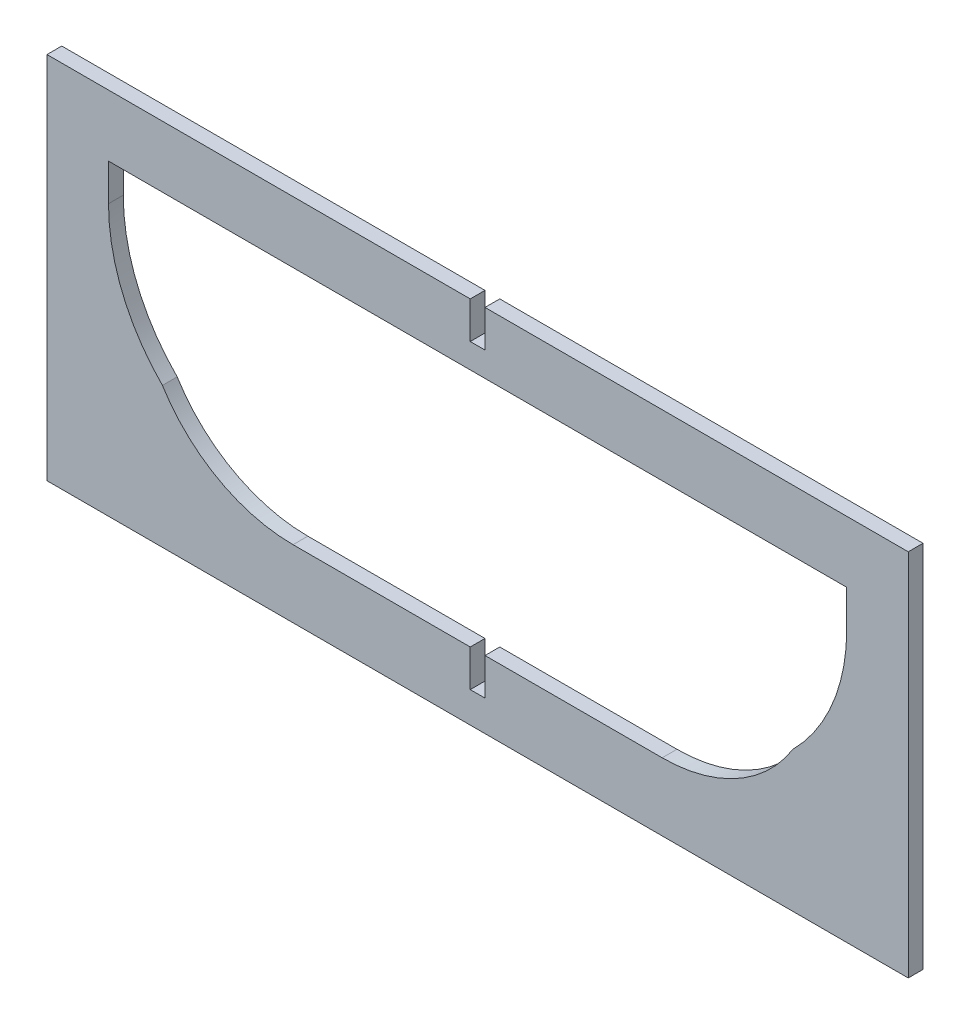
ISO-10303-21;
HEADER;
FILE_DESCRIPTION(('STEP AP214'),'2;1');
FILE_NAME('part.step','',(''),(''),'','','');
FILE_SCHEMA(('AUTOMOTIVE_DESIGN { 1 0 10303 214 1 1 1 1 }'));
ENDSEC;
DATA;
#1=APPLICATION_CONTEXT('core data for automotive mechanical design processes');
#2=APPLICATION_PROTOCOL_DEFINITION('international standard','automotive_design',2000,#1);
#3=PRODUCT_CONTEXT('',#1,'mechanical');
#4=PRODUCT('Part','Part','',(#3));
#5=PRODUCT_RELATED_PRODUCT_CATEGORY('part','',(#4));
#6=PRODUCT_DEFINITION_FORMATION('','',#4);
#7=PRODUCT_DEFINITION_CONTEXT('part definition',#1,'design');
#8=PRODUCT_DEFINITION('design','',#6,#7);
#9=PRODUCT_DEFINITION_SHAPE('','',#8);
#10=(LENGTH_UNIT() NAMED_UNIT(*) SI_UNIT(.MILLI.,.METRE.));
#11=(NAMED_UNIT(*) PLANE_ANGLE_UNIT() SI_UNIT($,.RADIAN.));
#12=(NAMED_UNIT(*) SI_UNIT($,.STERADIAN.) SOLID_ANGLE_UNIT());
#13=UNCERTAINTY_MEASURE_WITH_UNIT(LENGTH_MEASURE(1.E-05),#10,'distance_accuracy_value','');
#14=(GEOMETRIC_REPRESENTATION_CONTEXT(3) GLOBAL_UNCERTAINTY_ASSIGNED_CONTEXT((#13)) GLOBAL_UNIT_ASSIGNED_CONTEXT((#10,
#11,#12)) REPRESENTATION_CONTEXT('',''));
#15=CARTESIAN_POINT('',(0.,0.,0.));
#16=DIRECTION('',(0.,0.,1.));
#17=DIRECTION('',(1.,0.,0.));
#18=AXIS2_PLACEMENT_3D('',#15,#16,#17);
#19=CARTESIAN_POINT('',(-200.,150.,6.));
#20=DIRECTION('',(0.,-1.,0.));
#21=DIRECTION('',(1.,0.,0.));
#22=AXIS2_PLACEMENT_3D('',#19,#20,#21);
#23=PLANE('',#22);
#24=DIRECTION('',(-1.,0.,0.));
#25=VECTOR('',#24,1.);
#26=CARTESIAN_POINT('',(-200.,150.,6.));
#27=LINE('',#26,#25);
#28=CARTESIAN_POINT('',(-178.,150.,6.));
#29=VERTEX_POINT('',#28);
#30=CARTESIAN_POINT('',(-350.,150.,6.));
#31=VERTEX_POINT('',#30);
#32=EDGE_CURVE('E372',#29,#31,#27,.T.);
#33=ORIENTED_EDGE('',*,*,#32,.F.);
#34=DIRECTION('',(0.,0.,1.));
#35=VECTOR('',#34,1.);
#36=CARTESIAN_POINT('',(-178.,150.,0.));
#37=LINE('',#36,#35);
#38=CARTESIAN_POINT('',(-178.,150.,0.));
#39=VERTEX_POINT('',#38);
#40=EDGE_CURVE('E221',#39,#29,#37,.T.);
#41=ORIENTED_EDGE('',*,*,#40,.F.);
#42=DIRECTION('',(-1.,0.,0.));
#43=VECTOR('',#42,1.);
#44=CARTESIAN_POINT('',(-200.,150.,0.));
#45=LINE('',#44,#43);
#46=CARTESIAN_POINT('',(-350.,150.,0.));
#47=VERTEX_POINT('',#46);
#48=EDGE_CURVE('E207',#39,#47,#45,.T.);
#49=ORIENTED_EDGE('',*,*,#48,.T.);
#50=DIRECTION('',(0.,0.,1.));
#51=VECTOR('',#50,1.);
#52=CARTESIAN_POINT('',(-350.,150.,0.));
#53=LINE('',#52,#51);
#54=EDGE_CURVE('E304',#47,#31,#53,.T.);
#55=ORIENTED_EDGE('',*,*,#54,.T.);
#56=EDGE_LOOP('',(#33,#41,#49,#55));
#57=FACE_BOUND('',#56,.T.);
#58=ADVANCED_FACE('F43',(#57),#23,.F.);
#59=CARTESIAN_POINT('',(-100.,27.5,0.));
#60=DIRECTION('',(0.,-1.,0.));
#61=DIRECTION('',(0.,0.,-1.));
#62=AXIS2_PLACEMENT_3D('',#59,#60,#61);
#63=PLANE('',#62);
#64=DIRECTION('',(1.,0.,0.));
#65=VECTOR('',#64,1.);
#66=CARTESIAN_POINT('',(-100.,27.5,6.));
#67=LINE('',#66,#65);
#68=CARTESIAN_POINT('',(-250.,27.5,6.));
#69=VERTEX_POINT('',#68);
#70=CARTESIAN_POINT('',(-178.,27.5,6.));
#71=VERTEX_POINT('',#70);
#72=EDGE_CURVE('E323',#69,#71,#67,.T.);
#73=ORIENTED_EDGE('',*,*,#72,.T.);
#74=DIRECTION('',(0.,0.,1.));
#75=VECTOR('',#74,1.);
#76=CARTESIAN_POINT('',(-178.,27.5,0.));
#77=LINE('',#76,#75);
#78=CARTESIAN_POINT('',(-178.,27.5,0.));
#79=VERTEX_POINT('',#78);
#80=EDGE_CURVE('E240',#79,#71,#77,.T.);
#81=ORIENTED_EDGE('',*,*,#80,.F.);
#82=DIRECTION('',(1.,0.,0.));
#83=VECTOR('',#82,1.);
#84=CARTESIAN_POINT('',(-100.,27.5,0.));
#85=LINE('',#84,#83);
#86=CARTESIAN_POINT('',(-250.,27.5,0.));
#87=VERTEX_POINT('',#86);
#88=EDGE_CURVE('E317',#87,#79,#85,.T.);
#89=ORIENTED_EDGE('',*,*,#88,.F.);
#90=DIRECTION('',(0.,0.,1.));
#91=VECTOR('',#90,1.);
#92=CARTESIAN_POINT('',(-250.,27.5,0.));
#93=LINE('',#92,#91);
#94=EDGE_CURVE('E295',#87,#69,#93,.T.);
#95=ORIENTED_EDGE('',*,*,#94,.T.);
#96=EDGE_LOOP('',(#73,#81,#89,#95));
#97=FACE_BOUND('',#96,.T.);
#98=ADVANCED_FACE('F446',(#97),#63,.F.);
#99=CARTESIAN_POINT('',(0.,0.,6.));
#100=DIRECTION('',(0.,0.,-1.));
#101=DIRECTION('',(-1.,0.,0.));
#102=AXIS2_PLACEMENT_3D('',#99,#100,#101);
#103=PLANE('',#102);
#104=DIRECTION('',(1.,0.,0.));
#105=VECTOR('',#104,1.);
#106=CARTESIAN_POINT('',(-178.,135.,6.));
#107=LINE('',#106,#105);
#108=CARTESIAN_POINT('',(-178.,135.,6.));
#109=VERTEX_POINT('',#108);
#110=CARTESIAN_POINT('',(-172.,135.,6.));
#111=VERTEX_POINT('',#110);
#112=EDGE_CURVE('E211',#109,#111,#107,.T.);
#113=ORIENTED_EDGE('',*,*,#112,.F.);
#114=DIRECTION('',(0.,-1.,0.));
#115=VECTOR('',#114,1.);
#116=CARTESIAN_POINT('',(-178.,150.,6.));
#117=LINE('',#116,#115);
#118=EDGE_CURVE('E187',#29,#109,#117,.T.);
#119=ORIENTED_EDGE('',*,*,#118,.F.);
#120=ORIENTED_EDGE('',*,*,#32,.T.);
#121=DIRECTION('',(0.,-1.,0.));
#122=VECTOR('',#121,1.);
#123=CARTESIAN_POINT('',(-350.,0.,6.));
#124=LINE('',#123,#122);
#125=CARTESIAN_POINT('',(-350.,0.,6.));
#126=VERTEX_POINT('',#125);
#127=EDGE_CURVE('E268',#31,#126,#124,.T.);
#128=ORIENTED_EDGE('',*,*,#127,.T.);
#129=DIRECTION('',(1.,0.,0.));
#130=VECTOR('',#129,1.);
#131=CARTESIAN_POINT('',(0.,0.,6.));
#132=LINE('',#131,#130);
#133=CARTESIAN_POINT('',(0.,0.,6.));
#134=VERTEX_POINT('',#133);
#135=EDGE_CURVE('E378',#126,#134,#132,.T.);
#136=ORIENTED_EDGE('',*,*,#135,.T.);
#137=DIRECTION('',(0.,1.,0.));
#138=VECTOR('',#137,1.);
#139=CARTESIAN_POINT('',(0.,0.,6.));
#140=LINE('',#139,#138);
#141=CARTESIAN_POINT('',(0.,150.,6.));
#142=VERTEX_POINT('',#141);
#143=EDGE_CURVE('E368',#134,#142,#140,.T.);
#144=ORIENTED_EDGE('',*,*,#143,.T.);
#145=CARTESIAN_POINT('',(-172.,150.,6.));
#146=VERTEX_POINT('',#145);
#147=EDGE_CURVE('E374',#142,#146,#27,.T.);
#148=ORIENTED_EDGE('',*,*,#147,.T.);
#149=DIRECTION('',(0.,1.,0.));
#150=VECTOR('',#149,1.);
#151=CARTESIAN_POINT('',(-172.,150.,6.));
#152=LINE('',#151,#150);
#153=EDGE_CURVE('E59',#111,#146,#152,.T.);
#154=ORIENTED_EDGE('',*,*,#153,.F.);
#155=EDGE_LOOP('',(#113,#119,#120,#128,#136,#144,#148,#154));
#156=FACE_BOUND('',#155,.T.);
#157=DIRECTION('',(1.,0.,0.));
#158=VECTOR('',#157,1.);
#159=CARTESIAN_POINT('',(-178.,12.5,6.));
#160=LINE('',#159,#158);
#161=CARTESIAN_POINT('',(-178.,12.5,6.));
#162=VERTEX_POINT('',#161);
#163=CARTESIAN_POINT('',(-172.,12.5,6.));
#164=VERTEX_POINT('',#163);
#165=EDGE_CURVE('E245',#162,#164,#160,.T.);
#166=ORIENTED_EDGE('',*,*,#165,.F.);
#167=DIRECTION('',(0.,-1.,0.));
#168=VECTOR('',#167,1.);
#169=CARTESIAN_POINT('',(-178.,27.5,6.));
#170=LINE('',#169,#168);
#171=EDGE_CURVE('E218',#71,#162,#170,.T.);
#172=ORIENTED_EDGE('',*,*,#171,.F.);
#173=ORIENTED_EDGE('',*,*,#72,.F.);
#174=CARTESIAN_POINT('',(-250.,90.,6.));
#175=DIRECTION('',(0.,0.,-1.));
#176=DIRECTION('',(1.,0.,0.));
#177=AXIS2_PLACEMENT_3D('',#174,#175,#176);
#178=CIRCLE('',#177,62.5);
#179=CARTESIAN_POINT('',(-303.097189411847,57.03125,6.));
#180=VERTEX_POINT('',#179);
#181=EDGE_CURVE('E224',#69,#180,#178,.T.);
#182=ORIENTED_EDGE('',*,*,#181,.T.);
#183=CARTESIAN_POINT('',(-250.,110.,6.));
#184=DIRECTION('',(0.,0.,-1.));
#185=DIRECTION('',(1.,0.,0.));
#186=AXIS2_PLACEMENT_3D('',#183,#184,#185);
#187=CIRCLE('',#186,75.);
#188=CARTESIAN_POINT('',(-325.,110.,6.));
#189=VERTEX_POINT('',#188);
#190=EDGE_CURVE('E284',#180,#189,#187,.T.);
#191=ORIENTED_EDGE('',*,*,#190,.T.);
#192=DIRECTION('',(0.,1.,0.));
#193=VECTOR('',#192,1.);
#194=CARTESIAN_POINT('',(-325.,110.,6.));
#195=LINE('',#194,#193);
#196=CARTESIAN_POINT('',(-325.,125.,6.));
#197=VERTEX_POINT('',#196);
#198=EDGE_CURVE('E288',#189,#197,#195,.T.);
#199=ORIENTED_EDGE('',*,*,#198,.T.);
#200=DIRECTION('',(-1.,0.,0.));
#201=VECTOR('',#200,1.);
#202=CARTESIAN_POINT('',(-175.,125.,6.));
#203=LINE('',#202,#201);
#204=CARTESIAN_POINT('',(-25.,125.,6.));
#205=VERTEX_POINT('',#204);
#206=EDGE_CURVE('E338',#205,#197,#203,.T.);
#207=ORIENTED_EDGE('',*,*,#206,.F.);
#208=DIRECTION('',(0.,1.,0.));
#209=VECTOR('',#208,1.);
#210=CARTESIAN_POINT('',(-25.,110.,6.));
#211=LINE('',#210,#209);
#212=CARTESIAN_POINT('',(-25.,110.,6.));
#213=VERTEX_POINT('',#212);
#214=EDGE_CURVE('E334',#213,#205,#211,.T.);
#215=ORIENTED_EDGE('',*,*,#214,.F.);
#216=CARTESIAN_POINT('',(-100.,110.,6.));
#217=DIRECTION('',(0.,0.,1.));
#218=DIRECTION('',(1.,0.,0.));
#219=AXIS2_PLACEMENT_3D('',#216,#217,#218);
#220=CIRCLE('',#219,75.);
#221=CARTESIAN_POINT('',(-46.9028105881536,57.03125,6.));
#222=VERTEX_POINT('',#221);
#223=EDGE_CURVE('E331',#222,#213,#220,.T.);
#224=ORIENTED_EDGE('',*,*,#223,.F.);
#225=CARTESIAN_POINT('',(-100.,90.,6.));
#226=DIRECTION('',(0.,0.,1.));
#227=DIRECTION('',(1.,0.,0.));
#228=AXIS2_PLACEMENT_3D('',#225,#226,#227);
#229=CIRCLE('',#228,62.5);
#230=CARTESIAN_POINT('',(-100.,27.5,6.));
#231=VERTEX_POINT('',#230);
#232=EDGE_CURVE('E341',#231,#222,#229,.T.);
#233=ORIENTED_EDGE('',*,*,#232,.F.);
#234=CARTESIAN_POINT('',(-172.,27.5,6.));
#235=VERTEX_POINT('',#234);
#236=EDGE_CURVE('E299',#235,#231,#67,.T.);
#237=ORIENTED_EDGE('',*,*,#236,.F.);
#238=DIRECTION('',(0.,1.,0.));
#239=VECTOR('',#238,1.);
#240=CARTESIAN_POINT('',(-172.,27.5,6.));
#241=LINE('',#240,#239);
#242=EDGE_CURVE('E67',#164,#235,#241,.T.);
#243=ORIENTED_EDGE('',*,*,#242,.F.);
#244=EDGE_LOOP('',(#166,#172,#173,#182,#191,#199,#207,#215,#224,#233,#237,#243));
#245=FACE_BOUND('',#244,.T.);
#246=ADVANCED_FACE('F401',(#156,#245),#103,.F.);
#247=CARTESIAN_POINT('',(0.,0.,0.));
#248=DIRECTION('',(0.,0.,-1.));
#249=DIRECTION('',(-1.,0.,0.));
#250=AXIS2_PLACEMENT_3D('',#247,#248,#249);
#251=PLANE('',#250);
#252=DIRECTION('',(0.,-1.,0.));
#253=VECTOR('',#252,1.);
#254=CARTESIAN_POINT('',(-178.,150.,0.));
#255=LINE('',#254,#253);
#256=CARTESIAN_POINT('',(-178.,135.,0.));
#257=VERTEX_POINT('',#256);
#258=EDGE_CURVE('E184',#39,#257,#255,.T.);
#259=ORIENTED_EDGE('',*,*,#258,.T.);
#260=DIRECTION('',(1.,0.,0.));
#261=VECTOR('',#260,1.);
#262=CARTESIAN_POINT('',(-178.,135.,0.));
#263=LINE('',#262,#261);
#264=CARTESIAN_POINT('',(-172.,135.,0.));
#265=VERTEX_POINT('',#264);
#266=EDGE_CURVE('E196',#257,#265,#263,.T.);
#267=ORIENTED_EDGE('',*,*,#266,.T.);
#268=DIRECTION('',(0.,1.,0.));
#269=VECTOR('',#268,1.);
#270=CARTESIAN_POINT('',(-172.,150.,0.));
#271=LINE('',#270,#269);
#272=CARTESIAN_POINT('',(-172.,150.,0.));
#273=VERTEX_POINT('',#272);
#274=EDGE_CURVE('E193',#265,#273,#271,.T.);
#275=ORIENTED_EDGE('',*,*,#274,.T.);
#276=CARTESIAN_POINT('',(0.,150.,0.));
#277=VERTEX_POINT('',#276);
#278=EDGE_CURVE('E384',#277,#273,#45,.T.);
#279=ORIENTED_EDGE('',*,*,#278,.F.);
#280=DIRECTION('',(0.,1.,0.));
#281=VECTOR('',#280,1.);
#282=CARTESIAN_POINT('',(0.,0.,0.));
#283=LINE('',#282,#281);
#284=CARTESIAN_POINT('',(0.,0.,0.));
#285=VERTEX_POINT('',#284);
#286=EDGE_CURVE('E367',#285,#277,#283,.T.);
#287=ORIENTED_EDGE('',*,*,#286,.F.);
#288=DIRECTION('',(1.,0.,0.));
#289=VECTOR('',#288,1.);
#290=CARTESIAN_POINT('',(0.,0.,0.));
#291=LINE('',#290,#289);
#292=CARTESIAN_POINT('',(-350.,0.,0.));
#293=VERTEX_POINT('',#292);
#294=EDGE_CURVE('E373',#293,#285,#291,.T.);
#295=ORIENTED_EDGE('',*,*,#294,.F.);
#296=DIRECTION('',(0.,-1.,0.));
#297=VECTOR('',#296,1.);
#298=CARTESIAN_POINT('',(-350.,0.,0.));
#299=LINE('',#298,#297);
#300=EDGE_CURVE('E276',#47,#293,#299,.T.);
#301=ORIENTED_EDGE('',*,*,#300,.F.);
#302=ORIENTED_EDGE('',*,*,#48,.F.);
#303=EDGE_LOOP('',(#259,#267,#275,#279,#287,#295,#301,#302));
#304=FACE_BOUND('',#303,.T.);
#305=DIRECTION('',(0.,-1.,0.));
#306=VECTOR('',#305,1.);
#307=CARTESIAN_POINT('',(-178.,27.5,0.));
#308=LINE('',#307,#306);
#309=CARTESIAN_POINT('',(-178.,12.5,0.));
#310=VERTEX_POINT('',#309);
#311=EDGE_CURVE('E246',#79,#310,#308,.T.);
#312=ORIENTED_EDGE('',*,*,#311,.T.);
#313=DIRECTION('',(1.,0.,0.));
#314=VECTOR('',#313,1.);
#315=CARTESIAN_POINT('',(-178.,12.5,0.));
#316=LINE('',#315,#314);
#317=CARTESIAN_POINT('',(-172.,12.5,0.));
#318=VERTEX_POINT('',#317);
#319=EDGE_CURVE('E256',#310,#318,#316,.T.);
#320=ORIENTED_EDGE('',*,*,#319,.T.);
#321=DIRECTION('',(0.,1.,0.));
#322=VECTOR('',#321,1.);
#323=CARTESIAN_POINT('',(-172.,27.5,0.));
#324=LINE('',#323,#322);
#325=CARTESIAN_POINT('',(-172.,27.5,0.));
#326=VERTEX_POINT('',#325);
#327=EDGE_CURVE('E233',#318,#326,#324,.T.);
#328=ORIENTED_EDGE('',*,*,#327,.T.);
#329=CARTESIAN_POINT('',(-100.,27.5,0.));
#330=VERTEX_POINT('',#329);
#331=EDGE_CURVE('E322',#326,#330,#85,.T.);
#332=ORIENTED_EDGE('',*,*,#331,.T.);
#333=CARTESIAN_POINT('',(-100.,90.,0.));
#334=DIRECTION('',(0.,0.,1.));
#335=DIRECTION('',(1.,0.,0.));
#336=AXIS2_PLACEMENT_3D('',#333,#334,#335);
#337=CIRCLE('',#336,62.5);
#338=CARTESIAN_POINT('',(-46.9028105881536,57.03125,0.));
#339=VERTEX_POINT('',#338);
#340=EDGE_CURVE('E335',#330,#339,#337,.T.);
#341=ORIENTED_EDGE('',*,*,#340,.T.);
#342=CARTESIAN_POINT('',(-100.,110.,0.));
#343=DIRECTION('',(0.,0.,1.));
#344=DIRECTION('',(1.,0.,0.));
#345=AXIS2_PLACEMENT_3D('',#342,#343,#344);
#346=CIRCLE('',#345,75.);
#347=CARTESIAN_POINT('',(-25.,110.,0.));
#348=VERTEX_POINT('',#347);
#349=EDGE_CURVE('E330',#339,#348,#346,.T.);
#350=ORIENTED_EDGE('',*,*,#349,.T.);
#351=DIRECTION('',(0.,1.,0.));
#352=VECTOR('',#351,1.);
#353=CARTESIAN_POINT('',(-25.,110.,0.));
#354=LINE('',#353,#352);
#355=CARTESIAN_POINT('',(-25.,125.,0.));
#356=VERTEX_POINT('',#355);
#357=EDGE_CURVE('E348',#348,#356,#354,.T.);
#358=ORIENTED_EDGE('',*,*,#357,.T.);
#359=DIRECTION('',(-1.,0.,0.));
#360=VECTOR('',#359,1.);
#361=CARTESIAN_POINT('',(-175.,125.,0.));
#362=LINE('',#361,#360);
#363=CARTESIAN_POINT('',(-325.,125.,0.));
#364=VERTEX_POINT('',#363);
#365=EDGE_CURVE('E352',#356,#364,#362,.T.);
#366=ORIENTED_EDGE('',*,*,#365,.T.);
#367=DIRECTION('',(0.,1.,0.));
#368=VECTOR('',#367,1.);
#369=CARTESIAN_POINT('',(-325.,110.,0.));
#370=LINE('',#369,#368);
#371=CARTESIAN_POINT('',(-325.,110.,0.));
#372=VERTEX_POINT('',#371);
#373=EDGE_CURVE('E272',#372,#364,#370,.T.);
#374=ORIENTED_EDGE('',*,*,#373,.F.);
#375=CARTESIAN_POINT('',(-250.,110.,0.));
#376=DIRECTION('',(0.,0.,-1.));
#377=DIRECTION('',(1.,0.,0.));
#378=AXIS2_PLACEMENT_3D('',#375,#376,#377);
#379=CIRCLE('',#378,75.);
#380=CARTESIAN_POINT('',(-303.097189411847,57.03125,0.));
#381=VERTEX_POINT('',#380);
#382=EDGE_CURVE('E267',#381,#372,#379,.T.);
#383=ORIENTED_EDGE('',*,*,#382,.F.);
#384=CARTESIAN_POINT('',(-250.,90.,0.));
#385=DIRECTION('',(0.,0.,-1.));
#386=DIRECTION('',(1.,0.,0.));
#387=AXIS2_PLACEMENT_3D('',#384,#385,#386);
#388=CIRCLE('',#387,62.5);
#389=EDGE_CURVE('E263',#87,#381,#388,.T.);
#390=ORIENTED_EDGE('',*,*,#389,.F.);
#391=ORIENTED_EDGE('',*,*,#88,.T.);
#392=EDGE_LOOP('',(#312,#320,#328,#332,#341,#350,#358,#366,#374,#383,#390,#391));
#393=FACE_BOUND('',#392,.T.);
#394=ADVANCED_FACE('F204',(#304,#393),#251,.T.);
#395=CARTESIAN_POINT('',(0.,0.,6.));
#396=DIRECTION('',(-1.,0.,0.));
#397=DIRECTION('',(0.,-1.,0.));
#398=AXIS2_PLACEMENT_3D('',#395,#396,#397);
#399=PLANE('',#398);
#400=ORIENTED_EDGE('',*,*,#286,.T.);
#401=DIRECTION('',(0.,0.,-1.));
#402=VECTOR('',#401,1.);
#403=CARTESIAN_POINT('',(0.,150.,6.));
#404=LINE('',#403,#402);
#405=EDGE_CURVE('E11',#142,#277,#404,.T.);
#406=ORIENTED_EDGE('',*,*,#405,.F.);
#407=ORIENTED_EDGE('',*,*,#143,.F.);
#408=DIRECTION('',(0.,0.,-1.));
#409=VECTOR('',#408,1.);
#410=CARTESIAN_POINT('',(0.,0.,6.));
#411=LINE('',#410,#409);
#412=EDGE_CURVE('E52',#134,#285,#411,.T.);
#413=ORIENTED_EDGE('',*,*,#412,.T.);
#414=EDGE_LOOP('',(#400,#406,#407,#413));
#415=FACE_BOUND('',#414,.T.);
#416=ADVANCED_FACE('F45',(#415),#399,.F.);
#417=ORIENTED_EDGE('',*,*,#278,.T.);
#418=DIRECTION('',(0.,0.,1.));
#419=VECTOR('',#418,1.);
#420=CARTESIAN_POINT('',(-172.,150.,0.));
#421=LINE('',#420,#419);
#422=EDGE_CURVE('E225',#273,#146,#421,.T.);
#423=ORIENTED_EDGE('',*,*,#422,.T.);
#424=ORIENTED_EDGE('',*,*,#147,.F.);
#425=ORIENTED_EDGE('',*,*,#405,.T.);
#426=EDGE_LOOP('',(#417,#423,#424,#425));
#427=FACE_BOUND('',#426,.T.);
#428=ADVANCED_FACE('F399',(#427),#23,.F.);
#429=CARTESIAN_POINT('',(0.,0.,6.));
#430=DIRECTION('',(0.,1.,0.));
#431=DIRECTION('',(-1.,0.,0.));
#432=AXIS2_PLACEMENT_3D('',#429,#430,#431);
#433=PLANE('',#432);
#434=ORIENTED_EDGE('',*,*,#294,.T.);
#435=ORIENTED_EDGE('',*,*,#412,.F.);
#436=ORIENTED_EDGE('',*,*,#135,.F.);
#437=DIRECTION('',(0.,0.,1.));
#438=VECTOR('',#437,1.);
#439=CARTESIAN_POINT('',(-350.,0.,0.));
#440=LINE('',#439,#438);
#441=EDGE_CURVE('E300',#293,#126,#440,.T.);
#442=ORIENTED_EDGE('',*,*,#441,.F.);
#443=EDGE_LOOP('',(#434,#435,#436,#442));
#444=FACE_BOUND('',#443,.T.);
#445=ADVANCED_FACE('F404',(#444),#433,.F.);
#446=CARTESIAN_POINT('',(-100.,110.,6.));
#447=DIRECTION('',(0.,0.,-1.));
#448=DIRECTION('',(-1.,0.,0.));
#449=AXIS2_PLACEMENT_3D('',#446,#447,#448);
#450=CYLINDRICAL_SURFACE('',#449,75.);
#451=ORIENTED_EDGE('',*,*,#349,.F.);
#452=DIRECTION('',(0.,0.,-1.));
#453=VECTOR('',#452,1.);
#454=CARTESIAN_POINT('',(-46.9028105881536,57.03125,6.));
#455=LINE('',#454,#453);
#456=EDGE_CURVE('E344',#222,#339,#455,.T.);
#457=ORIENTED_EDGE('',*,*,#456,.F.);
#458=ORIENTED_EDGE('',*,*,#223,.T.);
#459=DIRECTION('',(0.,0.,-1.));
#460=VECTOR('',#459,1.);
#461=CARTESIAN_POINT('',(-25.,110.,6.));
#462=LINE('',#461,#460);
#463=EDGE_CURVE('E363',#213,#348,#462,.T.);
#464=ORIENTED_EDGE('',*,*,#463,.T.);
#465=EDGE_LOOP('',(#451,#457,#458,#464));
#466=FACE_BOUND('',#465,.T.);
#467=ADVANCED_FACE('F430',(#466),#450,.F.);
#468=CARTESIAN_POINT('',(-25.,110.,6.));
#469=DIRECTION('',(-1.,0.,0.));
#470=DIRECTION('',(0.,-1.,0.));
#471=AXIS2_PLACEMENT_3D('',#468,#469,#470);
#472=PLANE('',#471);
#473=ORIENTED_EDGE('',*,*,#357,.F.);
#474=ORIENTED_EDGE('',*,*,#463,.F.);
#475=ORIENTED_EDGE('',*,*,#214,.T.);
#476=DIRECTION('',(0.,0.,-1.));
#477=VECTOR('',#476,1.);
#478=CARTESIAN_POINT('',(-25.,125.,6.));
#479=LINE('',#478,#477);
#480=EDGE_CURVE('E360',#205,#356,#479,.T.);
#481=ORIENTED_EDGE('',*,*,#480,.T.);
#482=EDGE_LOOP('',(#473,#474,#475,#481));
#483=FACE_BOUND('',#482,.T.);
#484=ADVANCED_FACE('F432',(#483),#472,.T.);
#485=CARTESIAN_POINT('',(-175.,125.,6.));
#486=DIRECTION('',(0.,-1.,0.));
#487=DIRECTION('',(0.,0.,-1.));
#488=AXIS2_PLACEMENT_3D('',#485,#486,#487);
#489=PLANE('',#488);
#490=ORIENTED_EDGE('',*,*,#206,.T.);
#491=DIRECTION('',(0.,0.,1.));
#492=VECTOR('',#491,1.);
#493=CARTESIAN_POINT('',(-325.,125.,0.));
#494=LINE('',#493,#492);
#495=EDGE_CURVE('E308',#364,#197,#494,.T.);
#496=ORIENTED_EDGE('',*,*,#495,.F.);
#497=ORIENTED_EDGE('',*,*,#365,.F.);
#498=ORIENTED_EDGE('',*,*,#480,.F.);
#499=EDGE_LOOP('',(#490,#496,#497,#498));
#500=FACE_BOUND('',#499,.T.);
#501=ADVANCED_FACE('F460',(#500),#489,.T.);
#502=CARTESIAN_POINT('',(-100.,90.,6.));
#503=DIRECTION('',(0.,0.,-1.));
#504=DIRECTION('',(-1.,0.,0.));
#505=AXIS2_PLACEMENT_3D('',#502,#503,#504);
#506=CYLINDRICAL_SURFACE('',#505,62.5);
#507=DIRECTION('',(0.,0.,1.));
#508=VECTOR('',#507,1.);
#509=CARTESIAN_POINT('',(-100.,27.5,0.));
#510=LINE('',#509,#508);
#511=EDGE_CURVE('E321',#330,#231,#510,.T.);
#512=ORIENTED_EDGE('',*,*,#511,.T.);
#513=ORIENTED_EDGE('',*,*,#232,.T.);
#514=ORIENTED_EDGE('',*,*,#456,.T.);
#515=ORIENTED_EDGE('',*,*,#340,.F.);
#516=EDGE_LOOP('',(#512,#513,#514,#515));
#517=FACE_BOUND('',#516,.T.);
#518=ADVANCED_FACE('F421',(#517),#506,.F.);
#519=ORIENTED_EDGE('',*,*,#331,.F.);
#520=DIRECTION('',(0.,0.,1.));
#521=VECTOR('',#520,1.);
#522=CARTESIAN_POINT('',(-172.,27.5,0.));
#523=LINE('',#522,#521);
#524=EDGE_CURVE('E237',#326,#235,#523,.T.);
#525=ORIENTED_EDGE('',*,*,#524,.T.);
#526=ORIENTED_EDGE('',*,*,#236,.T.);
#527=ORIENTED_EDGE('',*,*,#511,.F.);
#528=EDGE_LOOP('',(#519,#525,#526,#527));
#529=FACE_BOUND('',#528,.T.);
#530=ADVANCED_FACE('F417',(#529),#63,.F.);
#531=CARTESIAN_POINT('',(-250.,90.,0.));
#532=DIRECTION('',(0.,0.,1.));
#533=DIRECTION('',(1.,0.,0.));
#534=AXIS2_PLACEMENT_3D('',#531,#532,#533);
#535=CYLINDRICAL_SURFACE('',#534,62.5);
#536=ORIENTED_EDGE('',*,*,#181,.F.);
#537=ORIENTED_EDGE('',*,*,#94,.F.);
#538=ORIENTED_EDGE('',*,*,#389,.T.);
#539=DIRECTION('',(0.,0.,1.));
#540=VECTOR('',#539,1.);
#541=CARTESIAN_POINT('',(-303.097189411847,57.03125,0.));
#542=LINE('',#541,#540);
#543=EDGE_CURVE('E280',#381,#180,#542,.T.);
#544=ORIENTED_EDGE('',*,*,#543,.T.);
#545=EDGE_LOOP('',(#536,#537,#538,#544));
#546=FACE_BOUND('',#545,.T.);
#547=ADVANCED_FACE('F451',(#546),#535,.F.);
#548=CARTESIAN_POINT('',(-350.,0.,0.));
#549=DIRECTION('',(-1.,0.,0.));
#550=DIRECTION('',(0.,0.,1.));
#551=AXIS2_PLACEMENT_3D('',#548,#549,#550);
#552=PLANE('',#551);
#553=ORIENTED_EDGE('',*,*,#127,.F.);
#554=ORIENTED_EDGE('',*,*,#54,.F.);
#555=ORIENTED_EDGE('',*,*,#300,.T.);
#556=ORIENTED_EDGE('',*,*,#441,.T.);
#557=EDGE_LOOP('',(#553,#554,#555,#556));
#558=FACE_BOUND('',#557,.T.);
#559=ADVANCED_FACE('F406',(#558),#552,.T.);
#560=CARTESIAN_POINT('',(-325.,110.,0.));
#561=DIRECTION('',(1.,0.,0.));
#562=DIRECTION('',(0.,0.,-1.));
#563=AXIS2_PLACEMENT_3D('',#560,#561,#562);
#564=PLANE('',#563);
#565=ORIENTED_EDGE('',*,*,#198,.F.);
#566=DIRECTION('',(0.,0.,1.));
#567=VECTOR('',#566,1.);
#568=CARTESIAN_POINT('',(-325.,110.,0.));
#569=LINE('',#568,#567);
#570=EDGE_CURVE('E312',#372,#189,#569,.T.);
#571=ORIENTED_EDGE('',*,*,#570,.F.);
#572=ORIENTED_EDGE('',*,*,#373,.T.);
#573=ORIENTED_EDGE('',*,*,#495,.T.);
#574=EDGE_LOOP('',(#565,#571,#572,#573));
#575=FACE_BOUND('',#574,.T.);
#576=ADVANCED_FACE('F458',(#575),#564,.T.);
#577=CARTESIAN_POINT('',(-250.,110.,0.));
#578=DIRECTION('',(0.,0.,1.));
#579=DIRECTION('',(1.,0.,0.));
#580=AXIS2_PLACEMENT_3D('',#577,#578,#579);
#581=CYLINDRICAL_SURFACE('',#580,75.);
#582=ORIENTED_EDGE('',*,*,#190,.F.);
#583=ORIENTED_EDGE('',*,*,#543,.F.);
#584=ORIENTED_EDGE('',*,*,#382,.T.);
#585=ORIENTED_EDGE('',*,*,#570,.T.);
#586=EDGE_LOOP('',(#582,#583,#584,#585));
#587=FACE_BOUND('',#586,.T.);
#588=ADVANCED_FACE('F455',(#587),#581,.F.);
#589=CARTESIAN_POINT('',(-178.,27.5,0.));
#590=DIRECTION('',(-1.,0.,0.));
#591=DIRECTION('',(0.,-1.,0.));
#592=AXIS2_PLACEMENT_3D('',#589,#590,#591);
#593=PLANE('',#592);
#594=ORIENTED_EDGE('',*,*,#171,.T.);
#595=DIRECTION('',(0.,0.,1.));
#596=VECTOR('',#595,1.);
#597=CARTESIAN_POINT('',(-178.,12.5,0.));
#598=LINE('',#597,#596);
#599=EDGE_CURVE('E230',#310,#162,#598,.T.);
#600=ORIENTED_EDGE('',*,*,#599,.F.);
#601=ORIENTED_EDGE('',*,*,#311,.F.);
#602=ORIENTED_EDGE('',*,*,#80,.T.);
#603=EDGE_LOOP('',(#594,#600,#601,#602));
#604=FACE_BOUND('',#603,.T.);
#605=ADVANCED_FACE('F555',(#604),#593,.F.);
#606=CARTESIAN_POINT('',(-172.,27.5,0.));
#607=DIRECTION('',(1.,0.,0.));
#608=DIRECTION('',(0.,1.,0.));
#609=AXIS2_PLACEMENT_3D('',#606,#607,#608);
#610=PLANE('',#609);
#611=ORIENTED_EDGE('',*,*,#242,.T.);
#612=ORIENTED_EDGE('',*,*,#524,.F.);
#613=ORIENTED_EDGE('',*,*,#327,.F.);
#614=DIRECTION('',(0.,0.,1.));
#615=VECTOR('',#614,1.);
#616=CARTESIAN_POINT('',(-172.,12.5,0.));
#617=LINE('',#616,#615);
#618=EDGE_CURVE('E234',#318,#164,#617,.T.);
#619=ORIENTED_EDGE('',*,*,#618,.T.);
#620=EDGE_LOOP('',(#611,#612,#613,#619));
#621=FACE_BOUND('',#620,.T.);
#622=ADVANCED_FACE('F439',(#621),#610,.F.);
#623=CARTESIAN_POINT('',(-178.,12.5,0.));
#624=DIRECTION('',(0.,-1.,0.));
#625=DIRECTION('',(1.,0.,0.));
#626=AXIS2_PLACEMENT_3D('',#623,#624,#625);
#627=PLANE('',#626);
#628=ORIENTED_EDGE('',*,*,#165,.T.);
#629=ORIENTED_EDGE('',*,*,#618,.F.);
#630=ORIENTED_EDGE('',*,*,#319,.F.);
#631=ORIENTED_EDGE('',*,*,#599,.T.);
#632=EDGE_LOOP('',(#628,#629,#630,#631));
#633=FACE_BOUND('',#632,.T.);
#634=ADVANCED_FACE('F441',(#633),#627,.F.);
#635=CARTESIAN_POINT('',(-178.,150.,0.));
#636=DIRECTION('',(-1.,0.,0.));
#637=DIRECTION('',(0.,0.,1.));
#638=AXIS2_PLACEMENT_3D('',#635,#636,#637);
#639=PLANE('',#638);
#640=ORIENTED_EDGE('',*,*,#118,.T.);
#641=DIRECTION('',(0.,0.,1.));
#642=VECTOR('',#641,1.);
#643=CARTESIAN_POINT('',(-178.,135.,0.));
#644=LINE('',#643,#642);
#645=EDGE_CURVE('E180',#257,#109,#644,.T.);
#646=ORIENTED_EDGE('',*,*,#645,.F.);
#647=ORIENTED_EDGE('',*,*,#258,.F.);
#648=ORIENTED_EDGE('',*,*,#40,.T.);
#649=EDGE_LOOP('',(#640,#646,#647,#648));
#650=FACE_BOUND('',#649,.T.);
#651=ADVANCED_FACE('F182',(#650),#639,.F.);
#652=CARTESIAN_POINT('',(-172.,150.,0.));
#653=DIRECTION('',(1.,0.,0.));
#654=DIRECTION('',(0.,0.,-1.));
#655=AXIS2_PLACEMENT_3D('',#652,#653,#654);
#656=PLANE('',#655);
#657=ORIENTED_EDGE('',*,*,#153,.T.);
#658=ORIENTED_EDGE('',*,*,#422,.F.);
#659=ORIENTED_EDGE('',*,*,#274,.F.);
#660=DIRECTION('',(0.,0.,1.));
#661=VECTOR('',#660,1.);
#662=CARTESIAN_POINT('',(-172.,135.,0.));
#663=LINE('',#662,#661);
#664=EDGE_CURVE('E192',#265,#111,#663,.T.);
#665=ORIENTED_EDGE('',*,*,#664,.T.);
#666=EDGE_LOOP('',(#657,#658,#659,#665));
#667=FACE_BOUND('',#666,.T.);
#668=ADVANCED_FACE('F626',(#667),#656,.F.);
#669=CARTESIAN_POINT('',(-178.,135.,0.));
#670=DIRECTION('',(0.,-1.,0.));
#671=DIRECTION('',(0.,0.,-1.));
#672=AXIS2_PLACEMENT_3D('',#669,#670,#671);
#673=PLANE('',#672);
#674=ORIENTED_EDGE('',*,*,#112,.T.);
#675=ORIENTED_EDGE('',*,*,#664,.F.);
#676=ORIENTED_EDGE('',*,*,#266,.F.);
#677=ORIENTED_EDGE('',*,*,#645,.T.);
#678=EDGE_LOOP('',(#674,#675,#676,#677));
#679=FACE_BOUND('',#678,.T.);
#680=ADVANCED_FACE('F197',(#679),#673,.F.);
#681=CLOSED_SHELL('',(#58,#98,#246,#394,#416,#428,#445,#467,#484,#501,#518,#530,#547,#559,#576,
#588,#605,#622,#634,#651,#668,#680));
#682=MANIFOLD_SOLID_BREP('B2',#681);
#683=ADVANCED_BREP_SHAPE_REPRESENTATION('',(#18,#682),#14);
#684=SHAPE_DEFINITION_REPRESENTATION(#9,#683);
ENDSEC;
END-ISO-10303-21;
